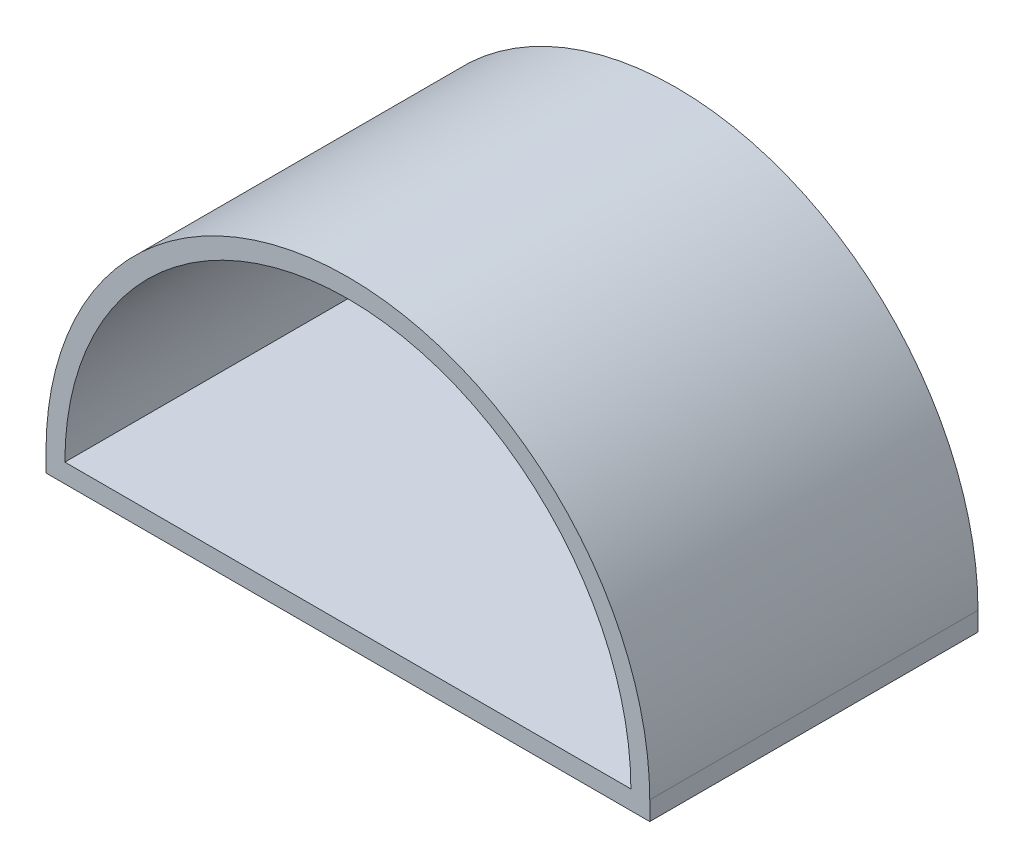
ISO-10303-21;
HEADER;
FILE_DESCRIPTION(('STEP AP214'),'2;1');
FILE_NAME('part.step','',(''),(''),'','','');
FILE_SCHEMA(('AUTOMOTIVE_DESIGN { 1 0 10303 214 1 1 1 1 }'));
ENDSEC;
DATA;
#1=APPLICATION_CONTEXT('core data for automotive mechanical design processes');
#2=APPLICATION_PROTOCOL_DEFINITION('international standard','automotive_design',2000,#1);
#3=PRODUCT_CONTEXT('',#1,'mechanical');
#4=PRODUCT('Part','Part','',(#3));
#5=PRODUCT_RELATED_PRODUCT_CATEGORY('part','',(#4));
#6=PRODUCT_DEFINITION_FORMATION('','',#4);
#7=PRODUCT_DEFINITION_CONTEXT('part definition',#1,'design');
#8=PRODUCT_DEFINITION('design','',#6,#7);
#9=PRODUCT_DEFINITION_SHAPE('','',#8);
#10=(LENGTH_UNIT() NAMED_UNIT(*) SI_UNIT(.MILLI.,.METRE.));
#11=(NAMED_UNIT(*) PLANE_ANGLE_UNIT() SI_UNIT($,.RADIAN.));
#12=(NAMED_UNIT(*) SI_UNIT($,.STERADIAN.) SOLID_ANGLE_UNIT());
#13=UNCERTAINTY_MEASURE_WITH_UNIT(LENGTH_MEASURE(1.E-05),#10,'distance_accuracy_value','');
#14=(GEOMETRIC_REPRESENTATION_CONTEXT(3) GLOBAL_UNCERTAINTY_ASSIGNED_CONTEXT((#13)) GLOBAL_UNIT_ASSIGNED_CONTEXT((#10,
#11,#12)) REPRESENTATION_CONTEXT('',''));
#15=CARTESIAN_POINT('',(0.,0.,0.));
#16=DIRECTION('',(0.,0.,1.));
#17=DIRECTION('',(1.,0.,0.));
#18=AXIS2_PLACEMENT_3D('',#15,#16,#17);
#19=CARTESIAN_POINT('',(95.1225657153884,0.,-110.49));
#20=DIRECTION('',(0.,-1.,0.));
#21=DIRECTION('',(0.,0.,-1.));
#22=AXIS2_PLACEMENT_3D('',#19,#20,#21);
#23=PLANE('',#22);
#24=DIRECTION('',(1.,0.,0.));
#25=VECTOR('',#24,1.);
#26=CARTESIAN_POINT('',(95.1225657153884,0.,0.));
#27=LINE('',#26,#25);
#28=CARTESIAN_POINT('',(0.,0.,0.));
#29=VERTEX_POINT('',#28);
#30=CARTESIAN_POINT('',(190.530204949484,0.,0.));
#31=VERTEX_POINT('',#30);
#32=EDGE_CURVE('E131',#29,#31,#27,.T.);
#33=ORIENTED_EDGE('',*,*,#32,.T.);
#34=DIRECTION('',(0.,0.,1.));
#35=VECTOR('',#34,1.);
#36=CARTESIAN_POINT('',(190.530204949484,0.,-110.49));
#37=LINE('',#36,#35);
#38=CARTESIAN_POINT('',(190.530204949484,0.,-110.49));
#39=VERTEX_POINT('',#38);
#40=EDGE_CURVE('E11',#39,#31,#37,.T.);
#41=ORIENTED_EDGE('',*,*,#40,.F.);
#42=DIRECTION('',(1.,0.,0.));
#43=VECTOR('',#42,1.);
#44=CARTESIAN_POINT('',(95.1225657153884,0.,-110.49));
#45=LINE('',#44,#43);
#46=CARTESIAN_POINT('',(0.,0.,-110.49));
#47=VERTEX_POINT('',#46);
#48=EDGE_CURVE('E48',#47,#39,#45,.T.);
#49=ORIENTED_EDGE('',*,*,#48,.F.);
#50=DIRECTION('',(0.,0.,1.));
#51=VECTOR('',#50,1.);
#52=CARTESIAN_POINT('',(0.,0.,-110.49));
#53=LINE('',#52,#51);
#54=EDGE_CURVE('E40',#47,#29,#53,.T.);
#55=ORIENTED_EDGE('',*,*,#54,.T.);
#56=EDGE_LOOP('',(#33,#41,#49,#55));
#57=FACE_BOUND('',#56,.T.);
#58=ADVANCED_FACE('F30',(#57),#23,.F.);
#59=CARTESIAN_POINT('',(95.2651024747422,1.10832797675331E-13,-110.49));
#60=DIRECTION('',(0.,0.,1.));
#61=DIRECTION('',(1.,0.,0.));
#62=AXIS2_PLACEMENT_3D('',#59,#60,#61);
#63=CYLINDRICAL_SURFACE('',#62,101.615102474742);
#64=CARTESIAN_POINT('',(95.2651024747422,1.10832797675331E-13,0.));
#65=DIRECTION('',(0.,0.,1.));
#66=DIRECTION('',(1.,0.,0.));
#67=AXIS2_PLACEMENT_3D('',#64,#65,#66);
#68=CIRCLE('',#67,101.615102474742);
#69=CARTESIAN_POINT('',(-6.34999999999999,0.,0.));
#70=VERTEX_POINT('',#69);
#71=CARTESIAN_POINT('',(196.880204949484,0.,0.));
#72=VERTEX_POINT('',#71);
#73=EDGE_CURVE('E112',#70,#72,#68,.F.);
#74=ORIENTED_EDGE('',*,*,#73,.T.);
#75=DIRECTION('',(0.,0.,1.));
#76=VECTOR('',#75,1.);
#77=CARTESIAN_POINT('',(196.880204949484,0.,-110.49));
#78=LINE('',#77,#76);
#79=CARTESIAN_POINT('',(196.880204949484,0.,-110.49));
#80=VERTEX_POINT('',#79);
#81=EDGE_CURVE('E96',#80,#72,#78,.T.);
#82=ORIENTED_EDGE('',*,*,#81,.F.);
#83=CARTESIAN_POINT('',(95.2651024747422,1.10832797675331E-13,-110.49));
#84=DIRECTION('',(0.,0.,1.));
#85=DIRECTION('',(1.,0.,0.));
#86=AXIS2_PLACEMENT_3D('',#83,#84,#85);
#87=CIRCLE('',#86,101.615102474742);
#88=CARTESIAN_POINT('',(-6.34999999999999,0.,-110.49));
#89=VERTEX_POINT('',#88);
#90=EDGE_CURVE('E105',#89,#80,#87,.F.);
#91=ORIENTED_EDGE('',*,*,#90,.F.);
#92=DIRECTION('',(0.,0.,1.));
#93=VECTOR('',#92,1.);
#94=CARTESIAN_POINT('',(-6.34999999999999,0.,-110.49));
#95=LINE('',#94,#93);
#96=EDGE_CURVE('E34',#89,#70,#95,.T.);
#97=ORIENTED_EDGE('',*,*,#96,.T.);
#98=EDGE_LOOP('',(#74,#82,#91,#97));
#99=FACE_BOUND('',#98,.T.);
#100=ADVANCED_FACE('F32',(#99),#63,.T.);
#101=CARTESIAN_POINT('',(196.880204949484,-131.702435329875,-110.49));
#102=DIRECTION('',(-1.,0.,0.));
#103=DIRECTION('',(0.,0.,1.));
#104=AXIS2_PLACEMENT_3D('',#101,#102,#103);
#105=PLANE('',#104);
#106=DIRECTION('',(0.,-1.,0.));
#107=VECTOR('',#106,1.);
#108=CARTESIAN_POINT('',(196.880204949484,-131.702435329875,0.));
#109=LINE('',#108,#107);
#110=CARTESIAN_POINT('',(196.880204949484,-6.34999999999999,0.));
#111=VERTEX_POINT('',#110);
#112=EDGE_CURVE('E129',#72,#111,#109,.T.);
#113=ORIENTED_EDGE('',*,*,#112,.T.);
#114=DIRECTION('',(0.,0.,1.));
#115=VECTOR('',#114,1.);
#116=CARTESIAN_POINT('',(196.880204949484,-6.34999999999999,-110.49));
#117=LINE('',#116,#115);
#118=CARTESIAN_POINT('',(196.880204949484,-6.34999999999999,-110.49));
#119=VERTEX_POINT('',#118);
#120=EDGE_CURVE('E98',#119,#111,#117,.T.);
#121=ORIENTED_EDGE('',*,*,#120,.F.);
#122=DIRECTION('',(0.,-1.,0.));
#123=VECTOR('',#122,1.);
#124=CARTESIAN_POINT('',(196.880204949484,-131.702435329875,-110.49));
#125=LINE('',#124,#123);
#126=EDGE_CURVE('E91',#80,#119,#125,.T.);
#127=ORIENTED_EDGE('',*,*,#126,.F.);
#128=ORIENTED_EDGE('',*,*,#81,.T.);
#129=EDGE_LOOP('',(#113,#121,#127,#128));
#130=FACE_BOUND('',#129,.T.);
#131=ADVANCED_FACE('F94',(#130),#105,.F.);
#132=CARTESIAN_POINT('',(95.1225657153884,-6.34999999999999,-110.49));
#133=DIRECTION('',(0.,-1.,0.));
#134=DIRECTION('',(0.,0.,-1.));
#135=AXIS2_PLACEMENT_3D('',#132,#133,#134);
#136=PLANE('',#135);
#137=DIRECTION('',(1.,0.,0.));
#138=VECTOR('',#137,1.);
#139=CARTESIAN_POINT('',(95.1225657153884,-6.34999999999999,0.));
#140=LINE('',#139,#138);
#141=CARTESIAN_POINT('',(-6.34999999999999,-6.34999999999999,0.));
#142=VERTEX_POINT('',#141);
#143=EDGE_CURVE('E126',#142,#111,#140,.T.);
#144=ORIENTED_EDGE('',*,*,#143,.F.);
#145=DIRECTION('',(0.,0.,1.));
#146=VECTOR('',#145,1.);
#147=CARTESIAN_POINT('',(-6.34999999999999,-6.34999999999999,-110.49));
#148=LINE('',#147,#146);
#149=CARTESIAN_POINT('',(-6.34999999999999,-6.34999999999999,-110.49));
#150=VERTEX_POINT('',#149);
#151=EDGE_CURVE('E115',#150,#142,#148,.T.);
#152=ORIENTED_EDGE('',*,*,#151,.F.);
#153=DIRECTION('',(1.,0.,0.));
#154=VECTOR('',#153,1.);
#155=CARTESIAN_POINT('',(95.1225657153884,-6.34999999999999,-110.49));
#156=LINE('',#155,#154);
#157=EDGE_CURVE('E102',#150,#119,#156,.T.);
#158=ORIENTED_EDGE('',*,*,#157,.T.);
#159=ORIENTED_EDGE('',*,*,#120,.T.);
#160=EDGE_LOOP('',(#144,#152,#158,#159));
#161=FACE_BOUND('',#160,.T.);
#162=ADVANCED_FACE('F155',(#161),#136,.T.);
#163=CARTESIAN_POINT('',(-6.34999999999999,-131.702435329875,-110.49));
#164=DIRECTION('',(-1.,0.,0.));
#165=DIRECTION('',(0.,0.,1.));
#166=AXIS2_PLACEMENT_3D('',#163,#164,#165);
#167=PLANE('',#166);
#168=DIRECTION('',(0.,-1.,0.));
#169=VECTOR('',#168,1.);
#170=CARTESIAN_POINT('',(-6.34999999999999,-131.702435329875,0.));
#171=LINE('',#170,#169);
#172=EDGE_CURVE('E123',#70,#142,#171,.T.);
#173=ORIENTED_EDGE('',*,*,#172,.F.);
#174=ORIENTED_EDGE('',*,*,#96,.F.);
#175=DIRECTION('',(0.,-1.,0.));
#176=VECTOR('',#175,1.);
#177=CARTESIAN_POINT('',(-6.34999999999999,-131.702435329875,-110.49));
#178=LINE('',#177,#176);
#179=EDGE_CURVE('E107',#89,#150,#178,.T.);
#180=ORIENTED_EDGE('',*,*,#179,.T.);
#181=ORIENTED_EDGE('',*,*,#151,.T.);
#182=EDGE_LOOP('',(#173,#174,#180,#181));
#183=FACE_BOUND('',#182,.T.);
#184=ADVANCED_FACE('F145',(#183),#167,.T.);
#185=CARTESIAN_POINT('',(95.2651024747422,1.10832797675331E-13,-110.49));
#186=DIRECTION('',(0.,0.,1.));
#187=DIRECTION('',(1.,0.,0.));
#188=AXIS2_PLACEMENT_3D('',#185,#186,#187);
#189=CYLINDRICAL_SURFACE('',#188,95.2651024747422);
#190=CARTESIAN_POINT('',(95.2651024747422,1.10832797675331E-13,0.));
#191=DIRECTION('',(0.,0.,1.));
#192=DIRECTION('',(1.,0.,0.));
#193=AXIS2_PLACEMENT_3D('',#190,#191,#192);
#194=CIRCLE('',#193,95.2651024747422);
#195=EDGE_CURVE('E109',#29,#31,#194,.F.);
#196=ORIENTED_EDGE('',*,*,#195,.F.);
#197=ORIENTED_EDGE('',*,*,#54,.F.);
#198=CARTESIAN_POINT('',(95.2651024747422,1.10832797675331E-13,-110.49));
#199=DIRECTION('',(0.,0.,1.));
#200=DIRECTION('',(1.,0.,0.));
#201=AXIS2_PLACEMENT_3D('',#198,#199,#200);
#202=CIRCLE('',#201,95.2651024747422);
#203=EDGE_CURVE('E118',#47,#39,#202,.F.);
#204=ORIENTED_EDGE('',*,*,#203,.T.);
#205=ORIENTED_EDGE('',*,*,#40,.T.);
#206=EDGE_LOOP('',(#196,#197,#204,#205));
#207=FACE_BOUND('',#206,.T.);
#208=ADVANCED_FACE('F136',(#207),#189,.F.);
#209=CARTESIAN_POINT('',(95.1225657153884,-131.702435329875,-110.49));
#210=DIRECTION('',(0.,0.,1.));
#211=DIRECTION('',(1.,0.,0.));
#212=AXIS2_PLACEMENT_3D('',#209,#210,#211);
#213=PLANE('',#212);
#214=ORIENTED_EDGE('',*,*,#90,.T.);
#215=ORIENTED_EDGE('',*,*,#126,.T.);
#216=ORIENTED_EDGE('',*,*,#157,.F.);
#217=ORIENTED_EDGE('',*,*,#179,.F.);
#218=EDGE_LOOP('',(#214,#215,#216,#217));
#219=FACE_BOUND('',#218,.T.);
#220=ORIENTED_EDGE('',*,*,#48,.T.);
#221=ORIENTED_EDGE('',*,*,#203,.F.);
#222=EDGE_LOOP('',(#220,#221));
#223=FACE_BOUND('',#222,.T.);
#224=ADVANCED_FACE('F106',(#219,#223),#213,.F.);
#225=CARTESIAN_POINT('',(95.1225657153884,-131.702435329875,0.));
#226=DIRECTION('',(0.,0.,1.));
#227=DIRECTION('',(1.,0.,0.));
#228=AXIS2_PLACEMENT_3D('',#225,#226,#227);
#229=PLANE('',#228);
#230=ORIENTED_EDGE('',*,*,#73,.F.);
#231=ORIENTED_EDGE('',*,*,#172,.T.);
#232=ORIENTED_EDGE('',*,*,#143,.T.);
#233=ORIENTED_EDGE('',*,*,#112,.F.);
#234=EDGE_LOOP('',(#230,#231,#232,#233));
#235=FACE_BOUND('',#234,.T.);
#236=ORIENTED_EDGE('',*,*,#32,.F.);
#237=ORIENTED_EDGE('',*,*,#195,.T.);
#238=EDGE_LOOP('',(#236,#237));
#239=FACE_BOUND('',#238,.T.);
#240=ADVANCED_FACE('F135',(#235,#239),#229,.T.);
#241=CLOSED_SHELL('',(#58,#100,#131,#162,#184,#208,#224,#240));
#242=MANIFOLD_SOLID_BREP('B2',#241);
#243=ADVANCED_BREP_SHAPE_REPRESENTATION('',(#18,#242),#14);
#244=SHAPE_DEFINITION_REPRESENTATION(#9,#243);
ENDSEC;
END-ISO-10303-21;
